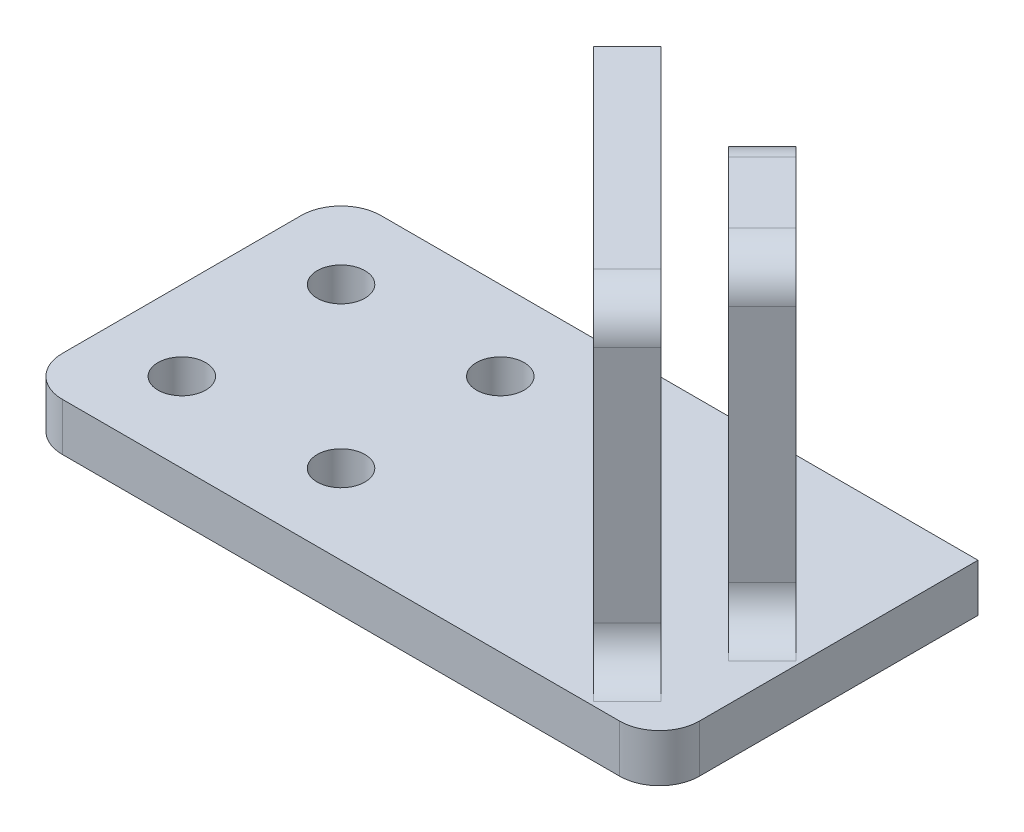
ISO-10303-21;
HEADER;
FILE_DESCRIPTION(('STEP AP214'),'2;1');
FILE_NAME('part.step','',(''),(''),'','','');
FILE_SCHEMA(('AUTOMOTIVE_DESIGN { 1 0 10303 214 1 1 1 1 }'));
ENDSEC;
DATA;
#1=APPLICATION_CONTEXT('core data for automotive mechanical design processes');
#2=APPLICATION_PROTOCOL_DEFINITION('international standard','automotive_design',2000,#1);
#3=PRODUCT_CONTEXT('',#1,'mechanical');
#4=PRODUCT('Part','Part','',(#3));
#5=PRODUCT_RELATED_PRODUCT_CATEGORY('part','',(#4));
#6=PRODUCT_DEFINITION_FORMATION('','',#4);
#7=PRODUCT_DEFINITION_CONTEXT('part definition',#1,'design');
#8=PRODUCT_DEFINITION('design','',#6,#7);
#9=PRODUCT_DEFINITION_SHAPE('','',#8);
#10=(LENGTH_UNIT() NAMED_UNIT(*) SI_UNIT(.MILLI.,.METRE.));
#11=(NAMED_UNIT(*) PLANE_ANGLE_UNIT() SI_UNIT($,.RADIAN.));
#12=(NAMED_UNIT(*) SI_UNIT($,.STERADIAN.) SOLID_ANGLE_UNIT());
#13=UNCERTAINTY_MEASURE_WITH_UNIT(LENGTH_MEASURE(1.E-05),#10,'distance_accuracy_value','');
#14=(GEOMETRIC_REPRESENTATION_CONTEXT(3) GLOBAL_UNCERTAINTY_ASSIGNED_CONTEXT((#13)) GLOBAL_UNIT_ASSIGNED_CONTEXT((#10,
#11,#12)) REPRESENTATION_CONTEXT('',''));
#15=CARTESIAN_POINT('',(0.,0.,0.));
#16=DIRECTION('',(0.,0.,1.));
#17=DIRECTION('',(1.,0.,0.));
#18=AXIS2_PLACEMENT_3D('',#15,#16,#17);
#19=CARTESIAN_POINT('',(0.,3.,0.));
#20=DIRECTION('',(0.,-1.,0.));
#21=DIRECTION('',(0.,0.,-1.));
#22=AXIS2_PLACEMENT_3D('',#19,#20,#21);
#23=PLANE('',#22);
#24=DIRECTION('',(-0.707106781186537,0.,-0.707106781186558));
#25=VECTOR('',#24,1.);
#26=CARTESIAN_POINT('',(22.0971684911148,3.,-18.));
#27=LINE('',#26,#25);
#28=CARTESIAN_POINT('',(37.7436151005211,3.,-2.35355339059323));
#29=VERTEX_POINT('',#28);
#30=CARTESIAN_POINT('',(22.0971684911148,3.,-18.));
#31=VERTEX_POINT('',#30);
#32=EDGE_CURVE('E207',#29,#31,#27,.T.);
#33=ORIENTED_EDGE('',*,*,#32,.F.);
#34=DIRECTION('',(0.707106781186558,0.,-0.707106781186537));
#35=VECTOR('',#34,1.);
#36=CARTESIAN_POINT('',(35.6222947569614,3.,-0.232233047033606));
#37=LINE('',#36,#35);
#38=CARTESIAN_POINT('',(35.6222947569614,3.,-0.232233047033606));
#39=VERTEX_POINT('',#38);
#40=EDGE_CURVE('E312',#29,#39,#37,.F.);
#41=ORIENTED_EDGE('',*,*,#40,.T.);
#42=DIRECTION('',(0.707106781186537,0.,0.707106781186558));
#43=VECTOR('',#42,1.);
#44=CARTESIAN_POINT('',(33.8545278039951,3.,-2.));
#45=LINE('',#44,#43);
#46=CARTESIAN_POINT('',(19.9758481475551,3.,-15.8786796564404));
#47=VERTEX_POINT('',#46);
#48=EDGE_CURVE('E200',#47,#39,#45,.T.);
#49=ORIENTED_EDGE('',*,*,#48,.F.);
#50=DIRECTION('',(-0.707106781186558,0.,0.707106781186536));
#51=VECTOR('',#50,1.);
#52=CARTESIAN_POINT('',(22.0971684911148,3.,-18.));
#53=LINE('',#52,#51);
#54=EDGE_CURVE('E223',#31,#47,#53,.T.);
#55=ORIENTED_EDGE('',*,*,#54,.F.);
#56=EDGE_LOOP('',(#33,#41,#49,#55));
#57=FACE_BOUND('',#56,.T.);
#58=DIRECTION('',(0.,0.,1.));
#59=VECTOR('',#58,1.);
#60=CARTESIAN_POINT('',(0.,3.,0.));
#61=LINE('',#60,#59);
#62=CARTESIAN_POINT('',(0.,3.,-17.5));
#63=VERTEX_POINT('',#62);
#64=CARTESIAN_POINT('',(0.,3.,-2.5));
#65=VERTEX_POINT('',#64);
#66=EDGE_CURVE('E257',#63,#65,#61,.T.);
#67=ORIENTED_EDGE('',*,*,#66,.T.);
#68=CARTESIAN_POINT('',(2.5,3.,-2.5));
#69=DIRECTION('',(0.,-1.,0.));
#70=DIRECTION('',(0.,0.,-1.));
#71=AXIS2_PLACEMENT_3D('',#68,#69,#70);
#72=CIRCLE('',#71,2.5);
#73=CARTESIAN_POINT('',(2.5,3.,0.));
#74=VERTEX_POINT('',#73);
#75=EDGE_CURVE('E325',#65,#74,#72,.F.);
#76=ORIENTED_EDGE('',*,*,#75,.T.);
#77=DIRECTION('',(1.,0.,0.));
#78=VECTOR('',#77,1.);
#79=CARTESIAN_POINT('',(0.,3.,0.));
#80=LINE('',#79,#78);
#81=CARTESIAN_POINT('',(37.5,3.,0.));
#82=VERTEX_POINT('',#81);
#83=EDGE_CURVE('E260',#74,#82,#80,.T.);
#84=ORIENTED_EDGE('',*,*,#83,.T.);
#85=CARTESIAN_POINT('',(37.5,3.,-2.5));
#86=DIRECTION('',(0.,-1.,0.));
#87=DIRECTION('',(0.,0.,-1.));
#88=AXIS2_PLACEMENT_3D('',#85,#86,#87);
#89=CIRCLE('',#88,2.5);
#90=CARTESIAN_POINT('',(40.,3.,-2.5));
#91=VERTEX_POINT('',#90);
#92=EDGE_CURVE('E321',#82,#91,#89,.F.);
#93=ORIENTED_EDGE('',*,*,#92,.T.);
#94=DIRECTION('',(0.,0.,-1.));
#95=VECTOR('',#94,1.);
#96=CARTESIAN_POINT('',(40.,3.,0.));
#97=LINE('',#96,#95);
#98=CARTESIAN_POINT('',(40.,3.,-20.));
#99=VERTEX_POINT('',#98);
#100=EDGE_CURVE('E264',#91,#99,#97,.T.);
#101=ORIENTED_EDGE('',*,*,#100,.T.);
#102=DIRECTION('',(-1.,0.,0.));
#103=VECTOR('',#102,1.);
#104=CARTESIAN_POINT('',(0.,3.,-20.));
#105=LINE('',#104,#103);
#106=CARTESIAN_POINT('',(2.5,3.,-20.));
#107=VERTEX_POINT('',#106);
#108=EDGE_CURVE('E266',#99,#107,#105,.T.);
#109=ORIENTED_EDGE('',*,*,#108,.T.);
#110=CARTESIAN_POINT('',(2.5,3.,-17.5));
#111=DIRECTION('',(0.,-1.,0.));
#112=DIRECTION('',(0.,0.,-1.));
#113=AXIS2_PLACEMENT_3D('',#110,#111,#112);
#114=CIRCLE('',#113,2.5);
#115=EDGE_CURVE('E323',#107,#63,#114,.F.);
#116=ORIENTED_EDGE('',*,*,#115,.T.);
#117=EDGE_LOOP('',(#67,#76,#84,#93,#101,#109,#116));
#118=FACE_BOUND('',#117,.T.);
#119=CARTESIAN_POINT('',(5.,3.,-5.));
#120=DIRECTION('',(0.,1.,0.));
#121=DIRECTION('',(0.,0.,1.));
#122=AXIS2_PLACEMENT_3D('',#119,#120,#121);
#123=CIRCLE('',#122,1.5);
#124=CARTESIAN_POINT('',(5.,3.,-3.5));
#125=VERTEX_POINT('',#124);
#126=EDGE_CURVE('E251',#125,#125,#123,.T.);
#127=ORIENTED_EDGE('',*,*,#126,.F.);
#128=EDGE_LOOP('',(#127));
#129=FACE_BOUND('',#128,.T.);
#130=CARTESIAN_POINT('',(15.,3.,-5.));
#131=DIRECTION('',(0.,1.,0.));
#132=DIRECTION('',(0.,0.,1.));
#133=AXIS2_PLACEMENT_3D('',#130,#131,#132);
#134=CIRCLE('',#133,1.5);
#135=CARTESIAN_POINT('',(15.,3.,-3.5));
#136=VERTEX_POINT('',#135);
#137=EDGE_CURVE('E245',#136,#136,#134,.T.);
#138=ORIENTED_EDGE('',*,*,#137,.F.);
#139=EDGE_LOOP('',(#138));
#140=FACE_BOUND('',#139,.T.);
#141=CARTESIAN_POINT('',(15.,3.,-15.));
#142=DIRECTION('',(0.,1.,0.));
#143=DIRECTION('',(0.,0.,1.));
#144=AXIS2_PLACEMENT_3D('',#141,#142,#143);
#145=CIRCLE('',#144,1.5);
#146=CARTESIAN_POINT('',(15.,3.,-13.5));
#147=VERTEX_POINT('',#146);
#148=EDGE_CURVE('E239',#147,#147,#145,.T.);
#149=ORIENTED_EDGE('',*,*,#148,.F.);
#150=EDGE_LOOP('',(#149));
#151=FACE_BOUND('',#150,.T.);
#152=CARTESIAN_POINT('',(4.99999999999997,3.,-15.));
#153=DIRECTION('',(0.,1.,0.));
#154=DIRECTION('',(0.,0.,1.));
#155=AXIS2_PLACEMENT_3D('',#152,#153,#154);
#156=CIRCLE('',#155,1.5);
#157=CARTESIAN_POINT('',(4.99999999999997,3.,-13.5));
#158=VERTEX_POINT('',#157);
#159=EDGE_CURVE('E233',#158,#158,#156,.T.);
#160=ORIENTED_EDGE('',*,*,#159,.F.);
#161=EDGE_LOOP('',(#160));
#162=FACE_BOUND('',#161,.T.);
#163=DIRECTION('',(-0.707106781186537,0.,-0.707106781186558));
#164=VECTOR('',#163,1.);
#165=CARTESIAN_POINT('',(30.5824498653532,3.,-18.));
#166=LINE('',#165,#164);
#167=CARTESIAN_POINT('',(39.7677669529663,3.,-8.81468291238661));
#168=VERTEX_POINT('',#167);
#169=CARTESIAN_POINT('',(28.8146829123869,3.,-19.7677669529664));
#170=VERTEX_POINT('',#169);
#171=EDGE_CURVE('E224',#168,#170,#166,.T.);
#172=ORIENTED_EDGE('',*,*,#171,.F.);
#173=DIRECTION('',(0.707106781186559,0.,-0.707106781186536));
#174=VECTOR('',#173,1.);
#175=CARTESIAN_POINT('',(37.6464466094067,3.,-6.693362568827));
#176=LINE('',#175,#174);
#177=CARTESIAN_POINT('',(37.6464466094067,3.,-6.693362568827));
#178=VERTEX_POINT('',#177);
#179=EDGE_CURVE('E318',#168,#178,#176,.F.);
#180=ORIENTED_EDGE('',*,*,#179,.T.);
#181=DIRECTION('',(0.707106781186537,0.,0.707106781186558));
#182=VECTOR('',#181,1.);
#183=CARTESIAN_POINT('',(35.8786796564403,3.,-8.4611295217934));
#184=LINE('',#183,#182);
#185=CARTESIAN_POINT('',(26.6933625688272,3.,-17.6464466094068));
#186=VERTEX_POINT('',#185);
#187=EDGE_CURVE('E484',#186,#178,#184,.T.);
#188=ORIENTED_EDGE('',*,*,#187,.F.);
#189=DIRECTION('',(-0.707106781186557,0.,0.707106781186538));
#190=VECTOR('',#189,1.);
#191=CARTESIAN_POINT('',(28.8146829123869,3.,-19.7677669529664));
#192=LINE('',#191,#190);
#193=EDGE_CURVE('E315',#186,#170,#192,.F.);
#194=ORIENTED_EDGE('',*,*,#193,.T.);
#195=EDGE_LOOP('',(#172,#180,#188,#194));
#196=FACE_BOUND('',#195,.T.);
#197=ADVANCED_FACE('F45',(#57,#118,#129,#140,#151,#162,#196),#23,.F.);
#198=CARTESIAN_POINT('',(0.,0.,0.));
#199=DIRECTION('',(0.,-1.,0.));
#200=DIRECTION('',(0.,0.,-1.));
#201=AXIS2_PLACEMENT_3D('',#198,#199,#200);
#202=PLANE('',#201);
#203=CARTESIAN_POINT('',(15.,0.,-15.));
#204=DIRECTION('',(0.,1.,0.));
#205=DIRECTION('',(0.,0.,1.));
#206=AXIS2_PLACEMENT_3D('',#203,#204,#205);
#207=CIRCLE('',#206,1.5);
#208=CARTESIAN_POINT('',(15.,0.,-13.5));
#209=VERTEX_POINT('',#208);
#210=EDGE_CURVE('E236',#209,#209,#207,.T.);
#211=ORIENTED_EDGE('',*,*,#210,.T.);
#212=EDGE_LOOP('',(#211));
#213=FACE_BOUND('',#212,.T.);
#214=CARTESIAN_POINT('',(5.,0.,-5.));
#215=DIRECTION('',(0.,1.,0.));
#216=DIRECTION('',(0.,0.,1.));
#217=AXIS2_PLACEMENT_3D('',#214,#215,#216);
#218=CIRCLE('',#217,1.5);
#219=CARTESIAN_POINT('',(5.,0.,-3.5));
#220=VERTEX_POINT('',#219);
#221=EDGE_CURVE('E248',#220,#220,#218,.T.);
#222=ORIENTED_EDGE('',*,*,#221,.T.);
#223=EDGE_LOOP('',(#222));
#224=FACE_BOUND('',#223,.T.);
#225=DIRECTION('',(1.,0.,0.));
#226=VECTOR('',#225,1.);
#227=CARTESIAN_POINT('',(0.,0.,0.));
#228=LINE('',#227,#226);
#229=CARTESIAN_POINT('',(2.5,0.,0.));
#230=VERTEX_POINT('',#229);
#231=CARTESIAN_POINT('',(37.5,0.,0.));
#232=VERTEX_POINT('',#231);
#233=EDGE_CURVE('E272',#230,#232,#228,.T.);
#234=ORIENTED_EDGE('',*,*,#233,.F.);
#235=CARTESIAN_POINT('',(2.5,0.,-2.5));
#236=DIRECTION('',(0.,-1.,0.));
#237=DIRECTION('',(0.,0.,-1.));
#238=AXIS2_PLACEMENT_3D('',#235,#236,#237);
#239=CIRCLE('',#238,2.5);
#240=CARTESIAN_POINT('',(0.,0.,-2.5));
#241=VERTEX_POINT('',#240);
#242=EDGE_CURVE('E305',#230,#241,#239,.T.);
#243=ORIENTED_EDGE('',*,*,#242,.T.);
#244=DIRECTION('',(0.,0.,1.));
#245=VECTOR('',#244,1.);
#246=CARTESIAN_POINT('',(0.,0.,0.));
#247=LINE('',#246,#245);
#248=CARTESIAN_POINT('',(0.,0.,-17.5));
#249=VERTEX_POINT('',#248);
#250=EDGE_CURVE('E254',#249,#241,#247,.T.);
#251=ORIENTED_EDGE('',*,*,#250,.F.);
#252=CARTESIAN_POINT('',(2.5,0.,-17.5));
#253=DIRECTION('',(0.,-1.,0.));
#254=DIRECTION('',(0.,0.,-1.));
#255=AXIS2_PLACEMENT_3D('',#252,#253,#254);
#256=CIRCLE('',#255,2.5);
#257=CARTESIAN_POINT('',(2.5,0.,-20.));
#258=VERTEX_POINT('',#257);
#259=EDGE_CURVE('E303',#249,#258,#256,.T.);
#260=ORIENTED_EDGE('',*,*,#259,.T.);
#261=DIRECTION('',(-1.,0.,0.));
#262=VECTOR('',#261,1.);
#263=CARTESIAN_POINT('',(0.,0.,-20.));
#264=LINE('',#263,#262);
#265=CARTESIAN_POINT('',(40.,0.,-20.));
#266=VERTEX_POINT('',#265);
#267=EDGE_CURVE('E261',#266,#258,#264,.T.);
#268=ORIENTED_EDGE('',*,*,#267,.F.);
#269=DIRECTION('',(0.,0.,-1.));
#270=VECTOR('',#269,1.);
#271=CARTESIAN_POINT('',(40.,0.,0.));
#272=LINE('',#271,#270);
#273=CARTESIAN_POINT('',(40.,0.,-2.5));
#274=VERTEX_POINT('',#273);
#275=EDGE_CURVE('E275',#274,#266,#272,.T.);
#276=ORIENTED_EDGE('',*,*,#275,.F.);
#277=CARTESIAN_POINT('',(37.5,0.,-2.5));
#278=DIRECTION('',(0.,-1.,0.));
#279=DIRECTION('',(0.,0.,-1.));
#280=AXIS2_PLACEMENT_3D('',#277,#278,#279);
#281=CIRCLE('',#280,2.5);
#282=EDGE_CURVE('E301',#274,#232,#281,.T.);
#283=ORIENTED_EDGE('',*,*,#282,.T.);
#284=EDGE_LOOP('',(#234,#243,#251,#260,#268,#276,#283));
#285=FACE_BOUND('',#284,.T.);
#286=CARTESIAN_POINT('',(15.,0.,-5.));
#287=DIRECTION('',(0.,1.,0.));
#288=DIRECTION('',(0.,0.,1.));
#289=AXIS2_PLACEMENT_3D('',#286,#287,#288);
#290=CIRCLE('',#289,1.5);
#291=CARTESIAN_POINT('',(15.,0.,-3.5));
#292=VERTEX_POINT('',#291);
#293=EDGE_CURVE('E242',#292,#292,#290,.T.);
#294=ORIENTED_EDGE('',*,*,#293,.T.);
#295=EDGE_LOOP('',(#294));
#296=FACE_BOUND('',#295,.T.);
#297=CARTESIAN_POINT('',(4.99999999999997,0.,-15.));
#298=DIRECTION('',(0.,1.,0.));
#299=DIRECTION('',(0.,0.,1.));
#300=AXIS2_PLACEMENT_3D('',#297,#298,#299);
#301=CIRCLE('',#300,1.5);
#302=CARTESIAN_POINT('',(4.99999999999997,0.,-13.5));
#303=VERTEX_POINT('',#302);
#304=EDGE_CURVE('E232',#303,#303,#301,.T.);
#305=ORIENTED_EDGE('',*,*,#304,.T.);
#306=EDGE_LOOP('',(#305));
#307=FACE_BOUND('',#306,.T.);
#308=ADVANCED_FACE('F401',(#213,#224,#285,#296,#307),#202,.T.);
#309=CARTESIAN_POINT('',(0.,3.,0.));
#310=DIRECTION('',(1.,0.,0.));
#311=DIRECTION('',(0.,0.,-1.));
#312=AXIS2_PLACEMENT_3D('',#309,#310,#311);
#313=PLANE('',#312);
#314=ORIENTED_EDGE('',*,*,#250,.T.);
#315=DIRECTION('',(0.,-1.,0.));
#316=VECTOR('',#315,1.);
#317=CARTESIAN_POINT('',(0.,3.,-2.5));
#318=LINE('',#317,#316);
#319=EDGE_CURVE('E310',#241,#65,#318,.F.);
#320=ORIENTED_EDGE('',*,*,#319,.T.);
#321=ORIENTED_EDGE('',*,*,#66,.F.);
#322=DIRECTION('',(0.,-1.,0.));
#323=VECTOR('',#322,1.);
#324=CARTESIAN_POINT('',(0.,3.,-17.5));
#325=LINE('',#324,#323);
#326=EDGE_CURVE('E307',#63,#249,#325,.T.);
#327=ORIENTED_EDGE('',*,*,#326,.T.);
#328=EDGE_LOOP('',(#314,#320,#321,#327));
#329=FACE_BOUND('',#328,.T.);
#330=ADVANCED_FACE('F407',(#329),#313,.F.);
#331=CARTESIAN_POINT('',(0.,3.,0.));
#332=DIRECTION('',(0.,0.,-1.));
#333=DIRECTION('',(-1.,0.,0.));
#334=AXIS2_PLACEMENT_3D('',#331,#332,#333);
#335=PLANE('',#334);
#336=ORIENTED_EDGE('',*,*,#83,.F.);
#337=DIRECTION('',(0.,-1.,0.));
#338=VECTOR('',#337,1.);
#339=CARTESIAN_POINT('',(2.5,3.,0.));
#340=LINE('',#339,#338);
#341=EDGE_CURVE('E298',#74,#230,#340,.T.);
#342=ORIENTED_EDGE('',*,*,#341,.T.);
#343=ORIENTED_EDGE('',*,*,#233,.T.);
#344=DIRECTION('',(0.,-1.,0.));
#345=VECTOR('',#344,1.);
#346=CARTESIAN_POINT('',(37.5,3.,0.));
#347=LINE('',#346,#345);
#348=EDGE_CURVE('E281',#232,#82,#347,.F.);
#349=ORIENTED_EDGE('',*,*,#348,.T.);
#350=EDGE_LOOP('',(#336,#342,#343,#349));
#351=FACE_BOUND('',#350,.T.);
#352=ADVANCED_FACE('F420',(#351),#335,.F.);
#353=CARTESIAN_POINT('',(40.,3.,0.));
#354=DIRECTION('',(-1.,0.,0.));
#355=DIRECTION('',(0.,0.,1.));
#356=AXIS2_PLACEMENT_3D('',#353,#354,#355);
#357=PLANE('',#356);
#358=ORIENTED_EDGE('',*,*,#100,.F.);
#359=DIRECTION('',(0.,-1.,0.));
#360=VECTOR('',#359,1.);
#361=CARTESIAN_POINT('',(40.,3.,-2.5));
#362=LINE('',#361,#360);
#363=EDGE_CURVE('E329',#91,#274,#362,.T.);
#364=ORIENTED_EDGE('',*,*,#363,.T.);
#365=ORIENTED_EDGE('',*,*,#275,.T.);
#366=DIRECTION('',(0.,-1.,0.));
#367=VECTOR('',#366,1.);
#368=CARTESIAN_POINT('',(40.,3.,-20.));
#369=LINE('',#368,#367);
#370=EDGE_CURVE('E269',#99,#266,#369,.T.);
#371=ORIENTED_EDGE('',*,*,#370,.F.);
#372=EDGE_LOOP('',(#358,#364,#365,#371));
#373=FACE_BOUND('',#372,.T.);
#374=ADVANCED_FACE('F416',(#373),#357,.F.);
#375=CARTESIAN_POINT('',(0.,3.,-20.));
#376=DIRECTION('',(0.,0.,1.));
#377=DIRECTION('',(1.,0.,0.));
#378=AXIS2_PLACEMENT_3D('',#375,#376,#377);
#379=PLANE('',#378);
#380=ORIENTED_EDGE('',*,*,#267,.T.);
#381=DIRECTION('',(0.,-1.,0.));
#382=VECTOR('',#381,1.);
#383=CARTESIAN_POINT('',(2.5,3.,-20.));
#384=LINE('',#383,#382);
#385=EDGE_CURVE('E327',#258,#107,#384,.F.);
#386=ORIENTED_EDGE('',*,*,#385,.T.);
#387=ORIENTED_EDGE('',*,*,#108,.F.);
#388=ORIENTED_EDGE('',*,*,#370,.T.);
#389=EDGE_LOOP('',(#380,#386,#387,#388));
#390=FACE_BOUND('',#389,.T.);
#391=ADVANCED_FACE('F414',(#390),#379,.F.);
#392=CARTESIAN_POINT('',(5.,3.,-5.));
#393=DIRECTION('',(0.,-1.,0.));
#394=DIRECTION('',(0.,0.,-1.));
#395=AXIS2_PLACEMENT_3D('',#392,#393,#394);
#396=CYLINDRICAL_SURFACE('',#395,1.5);
#397=ORIENTED_EDGE('',*,*,#126,.T.);
#398=EDGE_LOOP('',(#397));
#399=FACE_BOUND('',#398,.T.);
#400=ORIENTED_EDGE('',*,*,#221,.F.);
#401=EDGE_LOOP('',(#400));
#402=FACE_BOUND('',#401,.T.);
#403=ADVANCED_FACE('F411',(#399,#402),#396,.F.);
#404=CARTESIAN_POINT('',(15.,3.,-5.));
#405=DIRECTION('',(0.,-1.,0.));
#406=DIRECTION('',(0.,0.,-1.));
#407=AXIS2_PLACEMENT_3D('',#404,#405,#406);
#408=CYLINDRICAL_SURFACE('',#407,1.5);
#409=ORIENTED_EDGE('',*,*,#137,.T.);
#410=EDGE_LOOP('',(#409));
#411=FACE_BOUND('',#410,.T.);
#412=ORIENTED_EDGE('',*,*,#293,.F.);
#413=EDGE_LOOP('',(#412));
#414=FACE_BOUND('',#413,.T.);
#415=ADVANCED_FACE('F695',(#411,#414),#408,.F.);
#416=CARTESIAN_POINT('',(15.,3.,-15.));
#417=DIRECTION('',(0.,-1.,0.));
#418=DIRECTION('',(0.,0.,-1.));
#419=AXIS2_PLACEMENT_3D('',#416,#417,#418);
#420=CYLINDRICAL_SURFACE('',#419,1.5);
#421=ORIENTED_EDGE('',*,*,#148,.T.);
#422=EDGE_LOOP('',(#421));
#423=FACE_BOUND('',#422,.T.);
#424=ORIENTED_EDGE('',*,*,#210,.F.);
#425=EDGE_LOOP('',(#424));
#426=FACE_BOUND('',#425,.T.);
#427=ADVANCED_FACE('F397',(#423,#426),#420,.F.);
#428=CARTESIAN_POINT('',(4.99999999999997,3.,-15.));
#429=DIRECTION('',(0.,-1.,0.));
#430=DIRECTION('',(0.,0.,-1.));
#431=AXIS2_PLACEMENT_3D('',#428,#429,#430);
#432=CYLINDRICAL_SURFACE('',#431,1.5);
#433=ORIENTED_EDGE('',*,*,#159,.T.);
#434=EDGE_LOOP('',(#433));
#435=FACE_BOUND('',#434,.T.);
#436=ORIENTED_EDGE('',*,*,#304,.F.);
#437=EDGE_LOOP('',(#436));
#438=FACE_BOUND('',#437,.T.);
#439=ADVANCED_FACE('F388',(#435,#438),#432,.F.);
#440=CARTESIAN_POINT('',(35.9758481475548,23.,-4.12132034355962));
#441=DIRECTION('',(-0.707106781186537,0.,-0.707106781186558));
#442=DIRECTION('',(-0.707106781186558,0.,0.707106781186537));
#443=AXIS2_PLACEMENT_3D('',#440,#441,#442);
#444=PLANE('',#443);
#445=DIRECTION('',(0.,-1.,0.));
#446=VECTOR('',#445,1.);
#447=CARTESIAN_POINT('',(35.9758481475548,23.,-4.12132034355962));
#448=LINE('',#447,#446);
#449=CARTESIAN_POINT('',(35.9758481475548,20.5,-4.12132034355962));
#450=VERTEX_POINT('',#449);
#451=CARTESIAN_POINT('',(35.9758481475548,5.5,-4.12132034355962));
#452=VERTEX_POINT('',#451);
#453=EDGE_CURVE('E210',#450,#452,#448,.T.);
#454=ORIENTED_EDGE('',*,*,#453,.F.);
#455=DIRECTION('',(0.707106781186558,0.,-0.707106781186537));
#456=VECTOR('',#455,1.);
#457=CARTESIAN_POINT('',(35.9758481475548,20.5,-4.12132034355962));
#458=LINE('',#457,#456);
#459=CARTESIAN_POINT('',(33.8545278039951,20.5,-2.));
#460=VERTEX_POINT('',#459);
#461=EDGE_CURVE('E338',#450,#460,#458,.F.);
#462=ORIENTED_EDGE('',*,*,#461,.T.);
#463=DIRECTION('',(0.,-1.,0.));
#464=VECTOR('',#463,1.);
#465=CARTESIAN_POINT('',(33.8545278039951,23.,-2.));
#466=LINE('',#465,#464);
#467=CARTESIAN_POINT('',(33.8545278039951,5.5,-2.));
#468=VERTEX_POINT('',#467);
#469=EDGE_CURVE('E218',#460,#468,#466,.T.);
#470=ORIENTED_EDGE('',*,*,#469,.T.);
#471=DIRECTION('',(0.707106781186558,0.,-0.707106781186537));
#472=VECTOR('',#471,1.);
#473=CARTESIAN_POINT('',(35.9758481475548,5.5,-4.12132034355963));
#474=LINE('',#473,#472);
#475=EDGE_CURVE('E335',#468,#452,#474,.T.);
#476=ORIENTED_EDGE('',*,*,#475,.T.);
#477=EDGE_LOOP('',(#454,#462,#470,#476));
#478=FACE_BOUND('',#477,.T.);
#479=ADVANCED_FACE('F386',(#478),#444,.F.);
#480=CARTESIAN_POINT('',(22.0971684911148,23.,-18.));
#481=DIRECTION('',(-0.707106781186558,0.,0.707106781186537));
#482=DIRECTION('',(0.707106781186537,0.,0.707106781186558));
#483=AXIS2_PLACEMENT_3D('',#480,#481,#482);
#484=PLANE('',#483);
#485=CARTESIAN_POINT('',(29.8753430841666,18.,-10.221825406948));
#486=DIRECTION('',(-0.707106781186558,0.,0.707106781186537));
#487=DIRECTION('',(0.707106781186537,0.,0.707106781186558));
#488=AXIS2_PLACEMENT_3D('',#485,#486,#487);
#489=CIRCLE('',#488,1.5);
#490=CARTESIAN_POINT('',(30.9360032559464,18.,-9.16116523516816));
#491=VERTEX_POINT('',#490);
#492=EDGE_CURVE('E477',#491,#491,#489,.T.);
#493=ORIENTED_EDGE('',*,*,#492,.T.);
#494=EDGE_LOOP('',(#493));
#495=FACE_BOUND('',#494,.T.);
#496=CARTESIAN_POINT('',(29.8753430841665,13.,-10.221825406948));
#497=DIRECTION('',(-0.707106781186558,0.,0.707106781186537));
#498=DIRECTION('',(0.707106781186537,0.,0.707106781186558));
#499=AXIS2_PLACEMENT_3D('',#496,#497,#498);
#500=CIRCLE('',#499,1.5);
#501=CARTESIAN_POINT('',(30.9360032559463,13.,-9.1611652351682));
#502=VERTEX_POINT('',#501);
#503=EDGE_CURVE('E296',#502,#502,#500,.T.);
#504=ORIENTED_EDGE('',*,*,#503,.T.);
#505=EDGE_LOOP('',(#504));
#506=FACE_BOUND('',#505,.T.);
#507=CARTESIAN_POINT('',(29.8753430841665,8.,-10.2218254069481));
#508=DIRECTION('',(-0.707106781186558,0.,0.707106781186537));
#509=DIRECTION('',(0.707106781186537,0.,0.707106781186558));
#510=AXIS2_PLACEMENT_3D('',#507,#508,#509);
#511=CIRCLE('',#510,1.5);
#512=CARTESIAN_POINT('',(30.9360032559463,8.,-9.16116523516823));
#513=VERTEX_POINT('',#512);
#514=EDGE_CURVE('E291',#513,#513,#511,.T.);
#515=ORIENTED_EDGE('',*,*,#514,.T.);
#516=EDGE_LOOP('',(#515));
#517=FACE_BOUND('',#516,.T.);
#518=DIRECTION('',(-0.707106781186537,0.,-0.707106781186558));
#519=VECTOR('',#518,1.);
#520=CARTESIAN_POINT('',(22.0971684911148,23.,-18.));
#521=LINE('',#520,#519);
#522=CARTESIAN_POINT('',(34.2080811945884,23.,-5.88908729652602));
#523=VERTEX_POINT('',#522);
#524=CARTESIAN_POINT('',(22.0971684911148,23.,-18.));
#525=VERTEX_POINT('',#524);
#526=EDGE_CURVE('E190',#523,#525,#521,.T.);
#527=ORIENTED_EDGE('',*,*,#526,.F.);
#528=CARTESIAN_POINT('',(34.2080811945884,20.5,-5.88908729652602));
#529=DIRECTION('',(-0.707106781186558,0.,0.707106781186537));
#530=DIRECTION('',(0.707106781186537,0.,0.707106781186558));
#531=AXIS2_PLACEMENT_3D('',#528,#529,#530);
#532=CIRCLE('',#531,2.5);
#533=EDGE_CURVE('E333',#523,#450,#532,.F.);
#534=ORIENTED_EDGE('',*,*,#533,.T.);
#535=ORIENTED_EDGE('',*,*,#453,.T.);
#536=CARTESIAN_POINT('',(37.7436151005211,5.5,-2.35355339059323));
#537=DIRECTION('',(-0.707106781186558,0.,0.707106781186537));
#538=DIRECTION('',(0.707106781186537,0.,0.707106781186558));
#539=AXIS2_PLACEMENT_3D('',#536,#537,#538);
#540=CIRCLE('',#539,2.5);
#541=EDGE_CURVE('E53',#452,#29,#540,.T.);
#542=ORIENTED_EDGE('',*,*,#541,.T.);
#543=ORIENTED_EDGE('',*,*,#32,.T.);
#544=DIRECTION('',(0.,-1.,0.));
#545=VECTOR('',#544,1.);
#546=CARTESIAN_POINT('',(22.0971684911148,23.,-18.));
#547=LINE('',#546,#545);
#548=EDGE_CURVE('E204',#525,#31,#547,.T.);
#549=ORIENTED_EDGE('',*,*,#548,.F.);
#550=EDGE_LOOP('',(#527,#534,#535,#542,#543,#549));
#551=FACE_BOUND('',#550,.T.);
#552=ADVANCED_FACE('F205',(#495,#506,#517,#551),#484,.F.);
#553=CARTESIAN_POINT('',(22.0971684911148,23.,-18.));
#554=DIRECTION('',(0.707106781186537,0.,0.707106781186558));
#555=DIRECTION('',(0.707106781186558,0.,-0.707106781186537));
#556=AXIS2_PLACEMENT_3D('',#553,#554,#555);
#557=PLANE('',#556);
#558=ORIENTED_EDGE('',*,*,#54,.T.);
#559=DIRECTION('',(0.,-1.,0.));
#560=VECTOR('',#559,1.);
#561=CARTESIAN_POINT('',(19.9758481475551,23.,-15.8786796564404));
#562=LINE('',#561,#560);
#563=CARTESIAN_POINT('',(19.9758481475551,23.,-15.8786796564404));
#564=VERTEX_POINT('',#563);
#565=EDGE_CURVE('E211',#564,#47,#562,.T.);
#566=ORIENTED_EDGE('',*,*,#565,.F.);
#567=DIRECTION('',(-0.707106781186558,0.,0.707106781186536));
#568=VECTOR('',#567,1.);
#569=CARTESIAN_POINT('',(22.0971684911148,23.,-18.));
#570=LINE('',#569,#568);
#571=EDGE_CURVE('E195',#525,#564,#570,.T.);
#572=ORIENTED_EDGE('',*,*,#571,.F.);
#573=ORIENTED_EDGE('',*,*,#548,.T.);
#574=EDGE_LOOP('',(#558,#566,#572,#573));
#575=FACE_BOUND('',#574,.T.);
#576=ADVANCED_FACE('F213',(#575),#557,.F.);
#577=CARTESIAN_POINT('',(33.8545278039951,23.,-2.));
#578=DIRECTION('',(0.707106781186558,0.,-0.707106781186537));
#579=DIRECTION('',(-0.707106781186537,0.,-0.707106781186558));
#580=AXIS2_PLACEMENT_3D('',#577,#578,#579);
#581=PLANE('',#580);
#582=CARTESIAN_POINT('',(27.7540227406069,18.,-8.10050506338837));
#583=DIRECTION('',(0.707106781186558,0.,-0.707106781186537));
#584=DIRECTION('',(-0.707106781186537,0.,-0.707106781186558));
#585=AXIS2_PLACEMENT_3D('',#582,#583,#584);
#586=CIRCLE('',#585,1.5);
#587=CARTESIAN_POINT('',(26.6933625688271,18.,-9.16116523516821));
#588=VERTEX_POINT('',#587);
#589=EDGE_CURVE('E295',#588,#588,#586,.T.);
#590=ORIENTED_EDGE('',*,*,#589,.T.);
#591=EDGE_LOOP('',(#590));
#592=FACE_BOUND('',#591,.T.);
#593=CARTESIAN_POINT('',(27.7540227406069,13.,-8.10050506338841));
#594=DIRECTION('',(0.707106781186558,0.,-0.707106781186537));
#595=DIRECTION('',(-0.707106781186537,0.,-0.707106781186558));
#596=AXIS2_PLACEMENT_3D('',#593,#594,#595);
#597=CIRCLE('',#596,1.5);
#598=CARTESIAN_POINT('',(26.693362568827,13.,-9.16116523516825));
#599=VERTEX_POINT('',#598);
#600=EDGE_CURVE('E290',#599,#599,#597,.T.);
#601=ORIENTED_EDGE('',*,*,#600,.T.);
#602=EDGE_LOOP('',(#601));
#603=FACE_BOUND('',#602,.T.);
#604=CARTESIAN_POINT('',(27.7540227406068,8.,-8.10050506338845));
#605=DIRECTION('',(0.707106781186558,0.,-0.707106781186537));
#606=DIRECTION('',(-0.707106781186537,0.,-0.707106781186558));
#607=AXIS2_PLACEMENT_3D('',#604,#605,#606);
#608=CIRCLE('',#607,1.5);
#609=CARTESIAN_POINT('',(26.693362568827,8.,-9.16116523516829));
#610=VERTEX_POINT('',#609);
#611=EDGE_CURVE('E285',#610,#610,#608,.T.);
#612=ORIENTED_EDGE('',*,*,#611,.T.);
#613=EDGE_LOOP('',(#612));
#614=FACE_BOUND('',#613,.T.);
#615=ORIENTED_EDGE('',*,*,#469,.F.);
#616=CARTESIAN_POINT('',(32.0867608510288,20.5,-3.76776695296639));
#617=DIRECTION('',(0.707106781186558,0.,-0.707106781186537));
#618=DIRECTION('',(-0.707106781186537,0.,-0.707106781186558));
#619=AXIS2_PLACEMENT_3D('',#616,#617,#618);
#620=CIRCLE('',#619,2.5);
#621=CARTESIAN_POINT('',(32.0867608510287,23.,-3.76776695296639));
#622=VERTEX_POINT('',#621);
#623=EDGE_CURVE('E340',#460,#622,#620,.F.);
#624=ORIENTED_EDGE('',*,*,#623,.T.);
#625=DIRECTION('',(0.707106781186537,0.,0.707106781186558));
#626=VECTOR('',#625,1.);
#627=CARTESIAN_POINT('',(33.8545278039951,23.,-2.));
#628=LINE('',#627,#626);
#629=EDGE_CURVE('E216',#564,#622,#628,.T.);
#630=ORIENTED_EDGE('',*,*,#629,.F.);
#631=ORIENTED_EDGE('',*,*,#565,.T.);
#632=ORIENTED_EDGE('',*,*,#48,.T.);
#633=CARTESIAN_POINT('',(35.6222947569614,5.5,-0.232233047033606));
#634=DIRECTION('',(0.707106781186558,0.,-0.707106781186537));
#635=DIRECTION('',(-0.707106781186537,0.,-0.707106781186558));
#636=AXIS2_PLACEMENT_3D('',#633,#634,#635);
#637=CIRCLE('',#636,2.5);
#638=EDGE_CURVE('E11',#39,#468,#637,.T.);
#639=ORIENTED_EDGE('',*,*,#638,.T.);
#640=EDGE_LOOP('',(#615,#624,#630,#631,#632,#639));
#641=FACE_BOUND('',#640,.T.);
#642=ADVANCED_FACE('F380',(#592,#603,#614,#641),#581,.F.);
#643=CARTESIAN_POINT('',(0.,23.,0.));
#644=DIRECTION('',(0.,-1.,0.));
#645=DIRECTION('',(0.,0.,-1.));
#646=AXIS2_PLACEMENT_3D('',#643,#644,#645);
#647=PLANE('',#646);
#648=ORIENTED_EDGE('',*,*,#629,.T.);
#649=DIRECTION('',(0.707106781186558,0.,-0.707106781186537));
#650=VECTOR('',#649,1.);
#651=CARTESIAN_POINT('',(14.1594969490307,23.,14.1594969490311));
#652=LINE('',#651,#650);
#653=EDGE_CURVE('E198',#622,#523,#652,.T.);
#654=ORIENTED_EDGE('',*,*,#653,.T.);
#655=ORIENTED_EDGE('',*,*,#526,.T.);
#656=ORIENTED_EDGE('',*,*,#571,.T.);
#657=EDGE_LOOP('',(#648,#654,#655,#656));
#658=FACE_BOUND('',#657,.T.);
#659=ADVANCED_FACE('F193',(#658),#647,.F.);
#660=CARTESIAN_POINT('',(38.,23.,-10.582449865353));
#661=DIRECTION('',(-0.707106781186536,0.,-0.707106781186559));
#662=DIRECTION('',(-0.707106781186559,0.,0.707106781186536));
#663=AXIS2_PLACEMENT_3D('',#660,#661,#662);
#664=PLANE('',#663);
#665=DIRECTION('',(0.,-1.,0.));
#666=VECTOR('',#665,1.);
#667=CARTESIAN_POINT('',(38.,23.,-10.582449865353));
#668=LINE('',#667,#666);
#669=CARTESIAN_POINT('',(38.,20.5,-10.582449865353));
#670=VERTEX_POINT('',#669);
#671=CARTESIAN_POINT('',(38.,5.5,-10.582449865353));
#672=VERTEX_POINT('',#671);
#673=EDGE_CURVE('E473',#670,#672,#668,.T.);
#674=ORIENTED_EDGE('',*,*,#673,.F.);
#675=DIRECTION('',(0.707106781186559,0.,-0.707106781186536));
#676=VECTOR('',#675,1.);
#677=CARTESIAN_POINT('',(38.,20.5,-10.582449865353));
#678=LINE('',#677,#676);
#679=CARTESIAN_POINT('',(35.8786796564403,20.5,-8.4611295217934));
#680=VERTEX_POINT('',#679);
#681=EDGE_CURVE('E362',#670,#680,#678,.F.);
#682=ORIENTED_EDGE('',*,*,#681,.T.);
#683=DIRECTION('',(0.,-1.,0.));
#684=VECTOR('',#683,1.);
#685=CARTESIAN_POINT('',(35.8786796564403,23.,-8.4611295217934));
#686=LINE('',#685,#684);
#687=CARTESIAN_POINT('',(35.8786796564403,5.5,-8.4611295217934));
#688=VERTEX_POINT('',#687);
#689=EDGE_CURVE('E475',#680,#688,#686,.T.);
#690=ORIENTED_EDGE('',*,*,#689,.T.);
#691=DIRECTION('',(0.707106781186559,0.,-0.707106781186536));
#692=VECTOR('',#691,1.);
#693=CARTESIAN_POINT('',(38.,5.5,-10.582449865353));
#694=LINE('',#693,#692);
#695=EDGE_CURVE('E360',#688,#672,#694,.T.);
#696=ORIENTED_EDGE('',*,*,#695,.T.);
#697=EDGE_LOOP('',(#674,#682,#690,#696));
#698=FACE_BOUND('',#697,.T.);
#699=ADVANCED_FACE('F501',(#698),#664,.F.);
#700=CARTESIAN_POINT('',(30.5824498653532,23.,-18.));
#701=DIRECTION('',(-0.707106781186558,0.,0.707106781186537));
#702=DIRECTION('',(0.707106781186537,0.,0.707106781186558));
#703=AXIS2_PLACEMENT_3D('',#700,#701,#702);
#704=PLANE('',#703);
#705=CARTESIAN_POINT('',(34.1179837712859,18.,-14.4644660940672));
#706=DIRECTION('',(0.707106781186558,0.,-0.707106781186537));
#707=DIRECTION('',(-0.707106781186537,0.,-0.707106781186558));
#708=AXIS2_PLACEMENT_3D('',#705,#706,#707);
#709=CIRCLE('',#708,1.5);
#710=CARTESIAN_POINT('',(33.0573235995061,18.,-15.5251262658471));
#711=VERTEX_POINT('',#710);
#712=EDGE_CURVE('E286',#711,#711,#709,.T.);
#713=ORIENTED_EDGE('',*,*,#712,.F.);
#714=EDGE_LOOP('',(#713));
#715=FACE_BOUND('',#714,.T.);
#716=CARTESIAN_POINT('',(34.1179837712859,13.,-14.4644660940673));
#717=DIRECTION('',(0.707106781186558,0.,-0.707106781186537));
#718=DIRECTION('',(-0.707106781186537,0.,-0.707106781186558));
#719=AXIS2_PLACEMENT_3D('',#716,#717,#718);
#720=CIRCLE('',#719,1.5);
#721=CARTESIAN_POINT('',(33.0573235995061,13.,-15.5251262658471));
#722=VERTEX_POINT('',#721);
#723=EDGE_CURVE('E810',#722,#722,#720,.T.);
#724=ORIENTED_EDGE('',*,*,#723,.F.);
#725=EDGE_LOOP('',(#724));
#726=FACE_BOUND('',#725,.T.);
#727=CARTESIAN_POINT('',(34.1179837712858,8.,-14.4644660940673));
#728=DIRECTION('',(0.707106781186558,0.,-0.707106781186537));
#729=DIRECTION('',(-0.707106781186537,0.,-0.707106781186558));
#730=AXIS2_PLACEMENT_3D('',#727,#728,#729);
#731=CIRCLE('',#730,1.5);
#732=CARTESIAN_POINT('',(33.057323599506,8.,-15.5251262658471));
#733=VERTEX_POINT('',#732);
#734=EDGE_CURVE('E807',#733,#733,#731,.T.);
#735=ORIENTED_EDGE('',*,*,#734,.F.);
#736=EDGE_LOOP('',(#735));
#737=FACE_BOUND('',#736,.T.);
#738=DIRECTION('',(0.,-1.,0.));
#739=VECTOR('',#738,1.);
#740=CARTESIAN_POINT('',(30.5824498653532,23.,-18.));
#741=LINE('',#740,#739);
#742=CARTESIAN_POINT('',(30.5824498653532,20.5,-18.));
#743=VERTEX_POINT('',#742);
#744=CARTESIAN_POINT('',(30.5824498653532,5.5,-18.));
#745=VERTEX_POINT('',#744);
#746=EDGE_CURVE('E465',#743,#745,#741,.T.);
#747=ORIENTED_EDGE('',*,*,#746,.F.);
#748=CARTESIAN_POINT('',(32.3502168183196,20.5,-16.2322330470336));
#749=DIRECTION('',(-0.707106781186558,0.,0.707106781186537));
#750=DIRECTION('',(0.707106781186537,0.,0.707106781186558));
#751=AXIS2_PLACEMENT_3D('',#748,#749,#750);
#752=CIRCLE('',#751,2.5);
#753=CARTESIAN_POINT('',(32.3502168183196,23.,-16.2322330470336));
#754=VERTEX_POINT('',#753);
#755=EDGE_CURVE('E358',#743,#754,#752,.F.);
#756=ORIENTED_EDGE('',*,*,#755,.T.);
#757=DIRECTION('',(-0.707106781186537,0.,-0.707106781186558));
#758=VECTOR('',#757,1.);
#759=CARTESIAN_POINT('',(30.5824498653532,23.,-18.));
#760=LINE('',#759,#758);
#761=CARTESIAN_POINT('',(36.2322330470337,23.,-12.3502168183194));
#762=VERTEX_POINT('',#761);
#763=EDGE_CURVE('E486',#762,#754,#760,.T.);
#764=ORIENTED_EDGE('',*,*,#763,.F.);
#765=CARTESIAN_POINT('',(36.2322330470337,20.5,-12.3502168183194));
#766=DIRECTION('',(-0.707106781186558,0.,0.707106781186537));
#767=DIRECTION('',(0.707106781186537,0.,0.707106781186558));
#768=AXIS2_PLACEMENT_3D('',#765,#766,#767);
#769=CIRCLE('',#768,2.5);
#770=EDGE_CURVE('E68',#762,#670,#769,.F.);
#771=ORIENTED_EDGE('',*,*,#770,.T.);
#772=ORIENTED_EDGE('',*,*,#673,.T.);
#773=CARTESIAN_POINT('',(39.7677669529663,5.5,-8.81468291238661));
#774=DIRECTION('',(-0.707106781186558,0.,0.707106781186537));
#775=DIRECTION('',(0.707106781186537,0.,0.707106781186558));
#776=AXIS2_PLACEMENT_3D('',#773,#774,#775);
#777=CIRCLE('',#776,2.5);
#778=EDGE_CURVE('E60',#672,#168,#777,.T.);
#779=ORIENTED_EDGE('',*,*,#778,.T.);
#780=ORIENTED_EDGE('',*,*,#171,.T.);
#781=CARTESIAN_POINT('',(28.8146829123869,5.5,-19.7677669529664));
#782=DIRECTION('',(-0.707106781186558,0.,0.707106781186537));
#783=DIRECTION('',(0.707106781186537,0.,0.707106781186558));
#784=AXIS2_PLACEMENT_3D('',#781,#782,#783);
#785=CIRCLE('',#784,2.5);
#786=EDGE_CURVE('E370',#170,#745,#785,.T.);
#787=ORIENTED_EDGE('',*,*,#786,.T.);
#788=EDGE_LOOP('',(#747,#756,#764,#771,#772,#779,#780,#787));
#789=FACE_BOUND('',#788,.T.);
#790=ADVANCED_FACE('F464',(#715,#726,#737,#789),#704,.F.);
#791=CARTESIAN_POINT('',(28.4611295217936,23.,-15.8786796564404));
#792=DIRECTION('',(0.707106781186538,0.,0.707106781186557));
#793=DIRECTION('',(0.707106781186557,0.,-0.707106781186538));
#794=AXIS2_PLACEMENT_3D('',#791,#792,#793);
#795=PLANE('',#794);
#796=DIRECTION('',(0.,-1.,0.));
#797=VECTOR('',#796,1.);
#798=CARTESIAN_POINT('',(28.4611295217936,23.,-15.8786796564404));
#799=LINE('',#798,#797);
#800=CARTESIAN_POINT('',(28.4611295217936,20.5,-15.8786796564404));
#801=VERTEX_POINT('',#800);
#802=CARTESIAN_POINT('',(28.4611295217936,5.5,-15.8786796564404));
#803=VERTEX_POINT('',#802);
#804=EDGE_CURVE('E472',#801,#803,#799,.T.);
#805=ORIENTED_EDGE('',*,*,#804,.F.);
#806=DIRECTION('',(-0.707106781186557,0.,0.707106781186538));
#807=VECTOR('',#806,1.);
#808=CARTESIAN_POINT('',(28.4611295217936,20.5,-15.8786796564404));
#809=LINE('',#808,#807);
#810=EDGE_CURVE('E355',#801,#743,#809,.F.);
#811=ORIENTED_EDGE('',*,*,#810,.T.);
#812=ORIENTED_EDGE('',*,*,#746,.T.);
#813=DIRECTION('',(-0.707106781186557,0.,0.707106781186538));
#814=VECTOR('',#813,1.);
#815=CARTESIAN_POINT('',(28.4611295217936,5.5,-15.8786796564404));
#816=LINE('',#815,#814);
#817=EDGE_CURVE('E352',#745,#803,#816,.T.);
#818=ORIENTED_EDGE('',*,*,#817,.T.);
#819=EDGE_LOOP('',(#805,#811,#812,#818));
#820=FACE_BOUND('',#819,.T.);
#821=ADVANCED_FACE('F469',(#820),#795,.F.);
#822=CARTESIAN_POINT('',(35.8786796564403,23.,-8.4611295217934));
#823=DIRECTION('',(0.707106781186558,0.,-0.707106781186537));
#824=DIRECTION('',(-0.707106781186537,0.,-0.707106781186558));
#825=AXIS2_PLACEMENT_3D('',#822,#823,#824);
#826=PLANE('',#825);
#827=CARTESIAN_POINT('',(31.9966634277262,18.,-12.3431457505076));
#828=DIRECTION('',(0.707106781186558,0.,-0.707106781186537));
#829=DIRECTION('',(-0.707106781186537,0.,-0.707106781186558));
#830=AXIS2_PLACEMENT_3D('',#827,#828,#829);
#831=CIRCLE('',#830,1.5);
#832=CARTESIAN_POINT('',(30.9360032559464,18.,-13.4038059222874));
#833=VERTEX_POINT('',#832);
#834=EDGE_CURVE('E292',#833,#833,#831,.T.);
#835=ORIENTED_EDGE('',*,*,#834,.T.);
#836=EDGE_LOOP('',(#835));
#837=FACE_BOUND('',#836,.T.);
#838=CARTESIAN_POINT('',(31.9966634277262,13.,-12.3431457505076));
#839=DIRECTION('',(0.707106781186558,0.,-0.707106781186537));
#840=DIRECTION('',(-0.707106781186537,0.,-0.707106781186558));
#841=AXIS2_PLACEMENT_3D('',#838,#839,#840);
#842=CIRCLE('',#841,1.5);
#843=CARTESIAN_POINT('',(30.9360032559464,13.,-13.4038059222875));
#844=VERTEX_POINT('',#843);
#845=EDGE_CURVE('E287',#844,#844,#842,.T.);
#846=ORIENTED_EDGE('',*,*,#845,.T.);
#847=EDGE_LOOP('',(#846));
#848=FACE_BOUND('',#847,.T.);
#849=CARTESIAN_POINT('',(31.9966634277262,8.,-12.3431457505077));
#850=DIRECTION('',(0.707106781186558,0.,-0.707106781186537));
#851=DIRECTION('',(-0.707106781186537,0.,-0.707106781186558));
#852=AXIS2_PLACEMENT_3D('',#849,#850,#851);
#853=CIRCLE('',#852,1.5);
#854=CARTESIAN_POINT('',(30.9360032559464,8.,-13.4038059222875));
#855=VERTEX_POINT('',#854);
#856=EDGE_CURVE('E282',#855,#855,#853,.T.);
#857=ORIENTED_EDGE('',*,*,#856,.T.);
#858=EDGE_LOOP('',(#857));
#859=FACE_BOUND('',#858,.T.);
#860=DIRECTION('',(0.707106781186537,0.,0.707106781186558));
#861=VECTOR('',#860,1.);
#862=CARTESIAN_POINT('',(35.8786796564403,23.,-8.4611295217934));
#863=LINE('',#862,#861);
#864=CARTESIAN_POINT('',(30.2288964747599,23.,-14.110912703474));
#865=VERTEX_POINT('',#864);
#866=CARTESIAN_POINT('',(34.110912703474,23.,-10.2288964747598));
#867=VERTEX_POINT('',#866);
#868=EDGE_CURVE('E483',#865,#867,#863,.T.);
#869=ORIENTED_EDGE('',*,*,#868,.F.);
#870=CARTESIAN_POINT('',(30.2288964747599,20.5,-14.110912703474));
#871=DIRECTION('',(0.707106781186558,0.,-0.707106781186537));
#872=DIRECTION('',(-0.707106781186537,0.,-0.707106781186558));
#873=AXIS2_PLACEMENT_3D('',#870,#871,#872);
#874=CIRCLE('',#873,2.5);
#875=EDGE_CURVE('E350',#865,#801,#874,.F.);
#876=ORIENTED_EDGE('',*,*,#875,.T.);
#877=ORIENTED_EDGE('',*,*,#804,.T.);
#878=CARTESIAN_POINT('',(26.6933625688272,5.5,-17.6464466094068));
#879=DIRECTION('',(0.707106781186558,0.,-0.707106781186537));
#880=DIRECTION('',(-0.707106781186537,0.,-0.707106781186558));
#881=AXIS2_PLACEMENT_3D('',#878,#879,#880);
#882=CIRCLE('',#881,2.5);
#883=EDGE_CURVE('E367',#803,#186,#882,.T.);
#884=ORIENTED_EDGE('',*,*,#883,.T.);
#885=ORIENTED_EDGE('',*,*,#187,.T.);
#886=CARTESIAN_POINT('',(37.6464466094067,5.5,-6.693362568827));
#887=DIRECTION('',(0.707106781186558,0.,-0.707106781186537));
#888=DIRECTION('',(-0.707106781186537,0.,-0.707106781186558));
#889=AXIS2_PLACEMENT_3D('',#886,#887,#888);
#890=CIRCLE('',#889,2.5);
#891=EDGE_CURVE('E365',#178,#688,#890,.T.);
#892=ORIENTED_EDGE('',*,*,#891,.T.);
#893=ORIENTED_EDGE('',*,*,#689,.F.);
#894=CARTESIAN_POINT('',(34.110912703474,20.5,-10.2288964747598));
#895=DIRECTION('',(0.707106781186558,0.,-0.707106781186537));
#896=DIRECTION('',(-0.707106781186537,0.,-0.707106781186558));
#897=AXIS2_PLACEMENT_3D('',#894,#895,#896);
#898=CIRCLE('',#897,2.5);
#899=EDGE_CURVE('E348',#680,#867,#898,.F.);
#900=ORIENTED_EDGE('',*,*,#899,.T.);
#901=EDGE_LOOP('',(#869,#876,#877,#884,#885,#892,#893,#900));
#902=FACE_BOUND('',#901,.T.);
#903=ADVANCED_FACE('F496',(#837,#848,#859,#902),#826,.F.);
#904=CARTESIAN_POINT('',(0.,23.,0.));
#905=DIRECTION('',(0.,-1.,0.));
#906=DIRECTION('',(0.,0.,-1.));
#907=AXIS2_PLACEMENT_3D('',#904,#905,#906);
#908=PLANE('',#907);
#909=ORIENTED_EDGE('',*,*,#763,.T.);
#910=DIRECTION('',(-0.707106781186557,0.,0.707106781186538));
#911=VECTOR('',#910,1.);
#912=CARTESIAN_POINT('',(8.05899188564253,23.,8.05899188564275));
#913=LINE('',#912,#911);
#914=EDGE_CURVE('E345',#754,#865,#913,.T.);
#915=ORIENTED_EDGE('',*,*,#914,.T.);
#916=ORIENTED_EDGE('',*,*,#868,.T.);
#917=DIRECTION('',(0.707106781186559,0.,-0.707106781186536));
#918=VECTOR('',#917,1.);
#919=CARTESIAN_POINT('',(11.9410081143565,23.,11.9410081143569));
#920=LINE('',#919,#918);
#921=EDGE_CURVE('E342',#867,#762,#920,.T.);
#922=ORIENTED_EDGE('',*,*,#921,.T.);
#923=EDGE_LOOP('',(#909,#915,#916,#922));
#924=FACE_BOUND('',#923,.T.);
#925=ADVANCED_FACE('F492',(#924),#908,.F.);
#926=CARTESIAN_POINT('',(19.9758481475547,8.,-0.322330470336541));
#927=DIRECTION('',(0.707106781186558,0.,-0.707106781186537));
#928=DIRECTION('',(-0.707106781186537,0.,-0.707106781186558));
#929=AXIS2_PLACEMENT_3D('',#926,#927,#928);
#930=CYLINDRICAL_SURFACE('',#929,1.5);
#931=ORIENTED_EDGE('',*,*,#734,.T.);
#932=EDGE_LOOP('',(#931));
#933=FACE_BOUND('',#932,.T.);
#934=ORIENTED_EDGE('',*,*,#856,.F.);
#935=EDGE_LOOP('',(#934));
#936=FACE_BOUND('',#935,.T.);
#937=ADVANCED_FACE('F523',(#933,#936),#930,.F.);
#938=CARTESIAN_POINT('',(19.9758481475547,13.,-0.322330470336505));
#939=DIRECTION('',(0.707106781186558,0.,-0.707106781186537));
#940=DIRECTION('',(-0.707106781186537,0.,-0.707106781186558));
#941=AXIS2_PLACEMENT_3D('',#938,#939,#940);
#942=CYLINDRICAL_SURFACE('',#941,1.5);
#943=ORIENTED_EDGE('',*,*,#723,.T.);
#944=EDGE_LOOP('',(#943));
#945=FACE_BOUND('',#944,.T.);
#946=ORIENTED_EDGE('',*,*,#845,.F.);
#947=EDGE_LOOP('',(#946));
#948=FACE_BOUND('',#947,.T.);
#949=ADVANCED_FACE('F543',(#945,#948),#942,.F.);
#950=CARTESIAN_POINT('',(19.9758481475548,18.,-0.322330470336467));
#951=DIRECTION('',(0.707106781186558,0.,-0.707106781186537));
#952=DIRECTION('',(-0.707106781186537,0.,-0.707106781186558));
#953=AXIS2_PLACEMENT_3D('',#950,#951,#952);
#954=CYLINDRICAL_SURFACE('',#953,1.5);
#955=ORIENTED_EDGE('',*,*,#712,.T.);
#956=EDGE_LOOP('',(#955));
#957=FACE_BOUND('',#956,.T.);
#958=ORIENTED_EDGE('',*,*,#834,.F.);
#959=EDGE_LOOP('',(#958));
#960=FACE_BOUND('',#959,.T.);
#961=ADVANCED_FACE('F552',(#957,#960),#954,.F.);
#962=ORIENTED_EDGE('',*,*,#611,.F.);
#963=EDGE_LOOP('',(#962));
#964=FACE_BOUND('',#963,.T.);
#965=ORIENTED_EDGE('',*,*,#514,.F.);
#966=EDGE_LOOP('',(#965));
#967=FACE_BOUND('',#966,.T.);
#968=ADVANCED_FACE('F514',(#964,#967),#930,.F.);
#969=ORIENTED_EDGE('',*,*,#600,.F.);
#970=EDGE_LOOP('',(#969));
#971=FACE_BOUND('',#970,.T.);
#972=ORIENTED_EDGE('',*,*,#503,.F.);
#973=EDGE_LOOP('',(#972));
#974=FACE_BOUND('',#973,.T.);
#975=ADVANCED_FACE('F554',(#971,#974),#942,.F.);
#976=ORIENTED_EDGE('',*,*,#589,.F.);
#977=EDGE_LOOP('',(#976));
#978=FACE_BOUND('',#977,.T.);
#979=ORIENTED_EDGE('',*,*,#492,.F.);
#980=EDGE_LOOP('',(#979));
#981=FACE_BOUND('',#980,.T.);
#982=ADVANCED_FACE('F432',(#978,#981),#954,.F.);
#983=CARTESIAN_POINT('',(2.5,3.,-2.5));
#984=DIRECTION('',(0.,-1.,0.));
#985=DIRECTION('',(0.,0.,-1.));
#986=AXIS2_PLACEMENT_3D('',#983,#984,#985);
#987=CYLINDRICAL_SURFACE('',#986,2.5);
#988=ORIENTED_EDGE('',*,*,#75,.F.);
#989=ORIENTED_EDGE('',*,*,#319,.F.);
#990=ORIENTED_EDGE('',*,*,#242,.F.);
#991=ORIENTED_EDGE('',*,*,#341,.F.);
#992=EDGE_LOOP('',(#988,#989,#990,#991));
#993=FACE_BOUND('',#992,.T.);
#994=ADVANCED_FACE('F428',(#993),#987,.T.);
#995=CARTESIAN_POINT('',(2.5,3.,-17.5));
#996=DIRECTION('',(0.,-1.,0.));
#997=DIRECTION('',(0.,0.,-1.));
#998=AXIS2_PLACEMENT_3D('',#995,#996,#997);
#999=CYLINDRICAL_SURFACE('',#998,2.5);
#1000=ORIENTED_EDGE('',*,*,#115,.F.);
#1001=ORIENTED_EDGE('',*,*,#385,.F.);
#1002=ORIENTED_EDGE('',*,*,#259,.F.);
#1003=ORIENTED_EDGE('',*,*,#326,.F.);
#1004=EDGE_LOOP('',(#1000,#1001,#1002,#1003));
#1005=FACE_BOUND('',#1004,.T.);
#1006=ADVANCED_FACE('F431',(#1005),#999,.T.);
#1007=CARTESIAN_POINT('',(37.5,3.,-2.5));
#1008=DIRECTION('',(0.,-1.,0.));
#1009=DIRECTION('',(0.,0.,-1.));
#1010=AXIS2_PLACEMENT_3D('',#1007,#1008,#1009);
#1011=CYLINDRICAL_SURFACE('',#1010,2.5);
#1012=ORIENTED_EDGE('',*,*,#92,.F.);
#1013=ORIENTED_EDGE('',*,*,#348,.F.);
#1014=ORIENTED_EDGE('',*,*,#282,.F.);
#1015=ORIENTED_EDGE('',*,*,#363,.F.);
#1016=EDGE_LOOP('',(#1012,#1013,#1014,#1015));
#1017=FACE_BOUND('',#1016,.T.);
#1018=ADVANCED_FACE('F436',(#1017),#1011,.T.);
#1019=CARTESIAN_POINT('',(14.1594969490307,20.5,14.1594969490311));
#1020=DIRECTION('',(0.707106781186558,0.,-0.707106781186537));
#1021=DIRECTION('',(-0.707106781186537,0.,-0.707106781186558));
#1022=AXIS2_PLACEMENT_3D('',#1019,#1020,#1021);
#1023=CYLINDRICAL_SURFACE('',#1022,2.5);
#1024=ORIENTED_EDGE('',*,*,#623,.F.);
#1025=ORIENTED_EDGE('',*,*,#461,.F.);
#1026=ORIENTED_EDGE('',*,*,#533,.F.);
#1027=ORIENTED_EDGE('',*,*,#653,.F.);
#1028=EDGE_LOOP('',(#1024,#1025,#1026,#1027));
#1029=FACE_BOUND('',#1028,.T.);
#1030=ADVANCED_FACE('F383',(#1029),#1023,.T.);
#1031=CARTESIAN_POINT('',(8.05899188564253,20.5,8.05899188564275));
#1032=DIRECTION('',(-0.707106781186557,0.,0.707106781186538));
#1033=DIRECTION('',(0.707106781186538,0.,0.707106781186557));
#1034=AXIS2_PLACEMENT_3D('',#1031,#1032,#1033);
#1035=CYLINDRICAL_SURFACE('',#1034,2.5);
#1036=ORIENTED_EDGE('',*,*,#755,.F.);
#1037=ORIENTED_EDGE('',*,*,#810,.F.);
#1038=ORIENTED_EDGE('',*,*,#875,.F.);
#1039=ORIENTED_EDGE('',*,*,#914,.F.);
#1040=EDGE_LOOP('',(#1036,#1037,#1038,#1039));
#1041=FACE_BOUND('',#1040,.T.);
#1042=ADVANCED_FACE('F443',(#1041),#1035,.T.);
#1043=CARTESIAN_POINT('',(11.9410081143565,20.5,11.9410081143569));
#1044=DIRECTION('',(0.707106781186559,0.,-0.707106781186536));
#1045=DIRECTION('',(-0.707106781186536,0.,-0.707106781186559));
#1046=AXIS2_PLACEMENT_3D('',#1043,#1044,#1045);
#1047=CYLINDRICAL_SURFACE('',#1046,2.5);
#1048=ORIENTED_EDGE('',*,*,#899,.F.);
#1049=ORIENTED_EDGE('',*,*,#681,.F.);
#1050=ORIENTED_EDGE('',*,*,#770,.F.);
#1051=ORIENTED_EDGE('',*,*,#921,.F.);
#1052=EDGE_LOOP('',(#1048,#1049,#1050,#1051));
#1053=FACE_BOUND('',#1052,.T.);
#1054=ADVANCED_FACE('F446',(#1053),#1047,.T.);
#1055=CARTESIAN_POINT('',(39.7677669529663,5.5,-8.81468291238661));
#1056=DIRECTION('',(-0.707106781186559,0.,0.707106781186536));
#1057=DIRECTION('',(0.707106781186536,0.,0.707106781186559));
#1058=AXIS2_PLACEMENT_3D('',#1055,#1056,#1057);
#1059=CYLINDRICAL_SURFACE('',#1058,2.5);
#1060=ORIENTED_EDGE('',*,*,#891,.F.);
#1061=ORIENTED_EDGE('',*,*,#179,.F.);
#1062=ORIENTED_EDGE('',*,*,#778,.F.);
#1063=ORIENTED_EDGE('',*,*,#695,.F.);
#1064=EDGE_LOOP('',(#1060,#1061,#1062,#1063));
#1065=FACE_BOUND('',#1064,.T.);
#1066=ADVANCED_FACE('F450',(#1065),#1059,.F.);
#1067=CARTESIAN_POINT('',(26.6933625688272,5.5,-17.6464466094068));
#1068=DIRECTION('',(0.707106781186557,0.,-0.707106781186538));
#1069=DIRECTION('',(-0.707106781186538,0.,-0.707106781186557));
#1070=AXIS2_PLACEMENT_3D('',#1067,#1068,#1069);
#1071=CYLINDRICAL_SURFACE('',#1070,2.5);
#1072=ORIENTED_EDGE('',*,*,#786,.F.);
#1073=ORIENTED_EDGE('',*,*,#193,.F.);
#1074=ORIENTED_EDGE('',*,*,#883,.F.);
#1075=ORIENTED_EDGE('',*,*,#817,.F.);
#1076=EDGE_LOOP('',(#1072,#1073,#1074,#1075));
#1077=FACE_BOUND('',#1076,.T.);
#1078=ADVANCED_FACE('F453',(#1077),#1071,.F.);
#1079=CARTESIAN_POINT('',(37.7436151005211,5.5,-2.35355339059323));
#1080=DIRECTION('',(-0.707106781186558,0.,0.707106781186537));
#1081=DIRECTION('',(0.707106781186537,0.,0.707106781186558));
#1082=AXIS2_PLACEMENT_3D('',#1079,#1080,#1081);
#1083=CYLINDRICAL_SURFACE('',#1082,2.5);
#1084=ORIENTED_EDGE('',*,*,#638,.F.);
#1085=ORIENTED_EDGE('',*,*,#40,.F.);
#1086=ORIENTED_EDGE('',*,*,#541,.F.);
#1087=ORIENTED_EDGE('',*,*,#475,.F.);
#1088=EDGE_LOOP('',(#1084,#1085,#1086,#1087));
#1089=FACE_BOUND('',#1088,.T.);
#1090=ADVANCED_FACE('F47',(#1089),#1083,.F.);
#1091=CLOSED_SHELL('',(#197,#308,#330,#352,#374,#391,#403,#415,#427,#439,#479,#552,#576,#642,
#659,#699,#790,#821,#903,#925,#937,#949,#961,#968,#975,#982,#994,#1006,#1018,#1030,#1042,#1054,
#1066,#1078,#1090));
#1092=MANIFOLD_SOLID_BREP('B2',#1091);
#1093=ADVANCED_BREP_SHAPE_REPRESENTATION('',(#18,#1092),#14);
#1094=SHAPE_DEFINITION_REPRESENTATION(#9,#1093);
ENDSEC;
END-ISO-10303-21;
